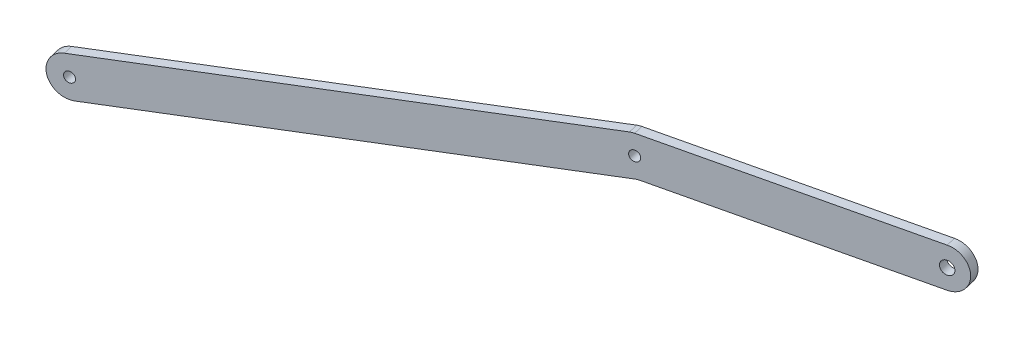
ISO-10303-21;
HEADER;
FILE_DESCRIPTION(('STEP AP214'),'2;1');
FILE_NAME('part.step','',(''),(''),'','','');
FILE_SCHEMA(('AUTOMOTIVE_DESIGN { 1 0 10303 214 1 1 1 1 }'));
ENDSEC;
DATA;
#1=APPLICATION_CONTEXT('core data for automotive mechanical design processes');
#2=APPLICATION_PROTOCOL_DEFINITION('international standard','automotive_design',2000,#1);
#3=PRODUCT_CONTEXT('',#1,'mechanical');
#4=PRODUCT('Part','Part','',(#3));
#5=PRODUCT_RELATED_PRODUCT_CATEGORY('part','',(#4));
#6=PRODUCT_DEFINITION_FORMATION('','',#4);
#7=PRODUCT_DEFINITION_CONTEXT('part definition',#1,'design');
#8=PRODUCT_DEFINITION('design','',#6,#7);
#9=PRODUCT_DEFINITION_SHAPE('','',#8);
#10=(LENGTH_UNIT() NAMED_UNIT(*) SI_UNIT(.MILLI.,.METRE.));
#11=(NAMED_UNIT(*) PLANE_ANGLE_UNIT() SI_UNIT($,.RADIAN.));
#12=(NAMED_UNIT(*) SI_UNIT($,.STERADIAN.) SOLID_ANGLE_UNIT());
#13=UNCERTAINTY_MEASURE_WITH_UNIT(LENGTH_MEASURE(1.E-05),#10,'distance_accuracy_value','');
#14=(GEOMETRIC_REPRESENTATION_CONTEXT(3) GLOBAL_UNCERTAINTY_ASSIGNED_CONTEXT((#13)) GLOBAL_UNIT_ASSIGNED_CONTEXT((#10,
#11,#12)) REPRESENTATION_CONTEXT('',''));
#15=CARTESIAN_POINT('',(0.,0.,0.));
#16=DIRECTION('',(0.,0.,1.));
#17=DIRECTION('',(1.,0.,0.));
#18=AXIS2_PLACEMENT_3D('',#15,#16,#17);
#19=CARTESIAN_POINT('',(-0.725230153584354,0.,-3.0910623132399));
#20=DIRECTION('',(0.22841894601082,0.,0.973562933303906));
#21=DIRECTION('',(0.973562933303906,0.,-0.22841894601082));
#22=AXIS2_PLACEMENT_3D('',#19,#20,#21);
#23=CYLINDRICAL_SURFACE('',#22,12.7);
#24=CARTESIAN_POINT('',(0.725230153584354,0.,3.0910623132399));
#25=DIRECTION('',(-0.22841894601082,0.,-0.973562933303906));
#26=DIRECTION('',(-0.973562933303906,0.,0.22841894601082));
#27=AXIS2_PLACEMENT_3D('',#24,#25,#26);
#28=CIRCLE('',#27,12.7);
#29=CARTESIAN_POINT('',(3.46788145490127,-12.3836097482895,2.44757692766136));
#30=VERTEX_POINT('',#29);
#31=CARTESIAN_POINT('',(-2.01742114773528,12.3836097482889,3.73454769881908));
#32=VERTEX_POINT('',#31);
#33=EDGE_CURVE('E159',#30,#32,#28,.T.);
#34=ORIENTED_EDGE('',*,*,#33,.T.);
#35=DIRECTION('',(0.22841894601082,0.,0.973562933303906));
#36=VECTOR('',#35,1.);
#37=CARTESIAN_POINT('',(-3.46788145490399,12.3836097482889,-2.44757692766073));
#38=LINE('',#37,#36);
#39=CARTESIAN_POINT('',(-3.46788145490399,12.3836097482889,-2.44757692766073));
#40=VERTEX_POINT('',#39);
#41=EDGE_CURVE('E11',#40,#32,#38,.T.);
#42=ORIENTED_EDGE('',*,*,#41,.F.);
#43=CARTESIAN_POINT('',(-0.725230153584354,0.,-3.0910623132399));
#44=DIRECTION('',(-0.22841894601082,0.,-0.973562933303906));
#45=DIRECTION('',(-0.973562933303906,0.,0.22841894601082));
#46=AXIS2_PLACEMENT_3D('',#43,#44,#45);
#47=CIRCLE('',#46,12.7);
#48=CARTESIAN_POINT('',(2.01742114773256,-12.3836097482895,-3.73454769881844));
#49=VERTEX_POINT('',#48);
#50=EDGE_CURVE('E233',#49,#40,#47,.T.);
#51=ORIENTED_EDGE('',*,*,#50,.F.);
#52=DIRECTION('',(0.22841894601082,0.,0.973562933303906));
#53=VECTOR('',#52,1.);
#54=CARTESIAN_POINT('',(2.01742114773256,-12.3836097482895,-3.73454769881844));
#55=LINE('',#54,#53);
#56=EDGE_CURVE('E154',#49,#30,#55,.T.);
#57=ORIENTED_EDGE('',*,*,#56,.T.);
#58=EDGE_LOOP('',(#34,#42,#51,#57));
#59=FACE_BOUND('',#58,.T.);
#60=ADVANCED_FACE('F45',(#59),#23,.T.);
#61=CARTESIAN_POINT('',(-3.46788145490265,12.3836097482892,-2.44757692766104));
#62=DIRECTION('',(0.215956795379393,-0.975087381755056,-0.0506681405967606));
#63=DIRECTION('',(0.976341448555132,0.216234538946179,0.));
#64=AXIS2_PLACEMENT_3D('',#61,#62,#63);
#65=PLANE('',#64);
#66=DIRECTION('',(0.949308931609078,0.221821094447914,-0.22272843200894));
#67=VECTOR('',#66,1.);
#68=CARTESIAN_POINT('',(-2.01742114773394,12.3836097482892,3.73454769881876));
#69=LINE('',#68,#67);
#70=CARTESIAN_POINT('',(294.94523679424,81.7736466493389,-65.9393223831915));
#71=VERTEX_POINT('',#70);
#72=EDGE_CURVE('E163',#32,#71,#69,.T.);
#73=ORIENTED_EDGE('',*,*,#72,.T.);
#74=DIRECTION('',(0.22841894601082,0.,0.973562933303906));
#75=VECTOR('',#74,1.);
#76=CARTESIAN_POINT('',(293.494776487071,81.7736466493389,-72.1214470096713));
#77=LINE('',#76,#75);
#78=CARTESIAN_POINT('',(293.494776487071,81.7736466493389,-72.1214470096713));
#79=VERTEX_POINT('',#78);
#80=EDGE_CURVE('E55',#79,#71,#77,.T.);
#81=ORIENTED_EDGE('',*,*,#80,.F.);
#82=DIRECTION('',(0.949308931609078,0.221821094447914,-0.22272843200894));
#83=VECTOR('',#82,1.);
#84=CARTESIAN_POINT('',(-3.46788145490265,12.3836097482892,-2.44757692766104));
#85=LINE('',#84,#83);
#86=EDGE_CURVE('E102',#40,#79,#85,.T.);
#87=ORIENTED_EDGE('',*,*,#86,.F.);
#88=ORIENTED_EDGE('',*,*,#41,.T.);
#89=EDGE_LOOP('',(#73,#81,#87,#88));
#90=FACE_BOUND('',#89,.T.);
#91=ADVANCED_FACE('F254',(#90),#65,.F.);
#92=CARTESIAN_POINT('',(296.237427788388,69.3900369010493,-72.7649323952498));
#93=DIRECTION('',(0.22841894601082,0.,0.973562933303906));
#94=DIRECTION('',(0.973562933303906,0.,-0.22841894601082));
#95=AXIS2_PLACEMENT_3D('',#92,#93,#94);
#96=CYLINDRICAL_SURFACE('',#95,12.7);
#97=CARTESIAN_POINT('',(297.687888095556,69.3900369010493,-66.58280776877));
#98=DIRECTION('',(-0.22841894601082,0.,-0.973562933303906));
#99=DIRECTION('',(-0.973562933303906,0.,0.22841894601082));
#100=AXIS2_PLACEMENT_3D('',#97,#98,#99);
#101=CIRCLE('',#100,12.7);
#102=CARTESIAN_POINT('',(297.687888095556,82.0900369010493,-66.58280776877));
#103=VERTEX_POINT('',#102);
#104=EDGE_CURVE('E166',#71,#103,#101,.T.);
#105=ORIENTED_EDGE('',*,*,#104,.T.);
#106=DIRECTION('',(0.22841894601082,0.,0.973562933303906));
#107=VECTOR('',#106,1.);
#108=CARTESIAN_POINT('',(296.237427788388,82.0900369010493,-72.7649323952498));
#109=LINE('',#108,#107);
#110=CARTESIAN_POINT('',(296.237427788388,82.0900369010493,-72.7649323952498));
#111=VERTEX_POINT('',#110);
#112=EDGE_CURVE('E201',#111,#103,#109,.T.);
#113=ORIENTED_EDGE('',*,*,#112,.F.);
#114=CARTESIAN_POINT('',(296.237427788388,69.3900369010493,-72.7649323952498));
#115=DIRECTION('',(-0.22841894601082,0.,-0.973562933303906));
#116=DIRECTION('',(-0.973562933303906,0.,0.22841894601082));
#117=AXIS2_PLACEMENT_3D('',#114,#115,#116);
#118=CIRCLE('',#117,12.7);
#119=EDGE_CURVE('E211',#79,#111,#118,.T.);
#120=ORIENTED_EDGE('',*,*,#119,.F.);
#121=ORIENTED_EDGE('',*,*,#80,.T.);
#122=EDGE_LOOP('',(#105,#113,#120,#121));
#123=FACE_BOUND('',#122,.T.);
#124=ADVANCED_FACE('F209',(#123),#96,.T.);
#125=CARTESIAN_POINT('',(-0.725230153584341,82.0900369010493,-3.09106231323976));
#126=DIRECTION('',(0.,-1.,0.));
#127=DIRECTION('',(0.,0.,-1.));
#128=AXIS2_PLACEMENT_3D('',#125,#126,#127);
#129=PLANE('',#128);
#130=DIRECTION('',(0.973562933303906,0.,-0.22841894601082));
#131=VECTOR('',#130,1.);
#132=CARTESIAN_POINT('',(0.725230153584366,82.0900369010493,3.09106231324005));
#133=LINE('',#132,#131);
#134=CARTESIAN_POINT('',(461.919917664668,82.0900369010494,-105.11519824104));
#135=VERTEX_POINT('',#134);
#136=EDGE_CURVE('E169',#103,#135,#133,.T.);
#137=ORIENTED_EDGE('',*,*,#136,.T.);
#138=DIRECTION('',(0.22841894601082,0.,0.973562933303906));
#139=VECTOR('',#138,1.);
#140=CARTESIAN_POINT('',(460.4694573575,82.0900369010495,-111.297322867519));
#141=LINE('',#140,#139);
#142=CARTESIAN_POINT('',(460.4694573575,82.0900369010495,-111.297322867519));
#143=VERTEX_POINT('',#142);
#144=EDGE_CURVE('E197',#143,#135,#141,.T.);
#145=ORIENTED_EDGE('',*,*,#144,.F.);
#146=DIRECTION('',(0.973562933303906,0.,-0.22841894601082));
#147=VECTOR('',#146,1.);
#148=CARTESIAN_POINT('',(-0.725230153584341,82.0900369010493,-3.09106231323976));
#149=LINE('',#148,#147);
#150=EDGE_CURVE('E225',#111,#143,#149,.T.);
#151=ORIENTED_EDGE('',*,*,#150,.F.);
#152=ORIENTED_EDGE('',*,*,#112,.T.);
#153=EDGE_LOOP('',(#137,#145,#151,#152));
#154=FACE_BOUND('',#153,.T.);
#155=ADVANCED_FACE('F220',(#154),#129,.F.);
#156=CARTESIAN_POINT('',(460.4694573575,69.3900369010495,-111.297322867519));
#157=DIRECTION('',(0.22841894601082,0.,0.973562933303906));
#158=DIRECTION('',(0.973562933303906,0.,-0.22841894601082));
#159=AXIS2_PLACEMENT_3D('',#156,#157,#158);
#160=CYLINDRICAL_SURFACE('',#159,12.7);
#161=CARTESIAN_POINT('',(461.919917664668,69.3900369010494,-105.11519824104));
#162=DIRECTION('',(-0.22841894601082,0.,-0.973562933303906));
#163=DIRECTION('',(-0.973562933303906,0.,0.22841894601082));
#164=AXIS2_PLACEMENT_3D('',#161,#162,#163);
#165=CIRCLE('',#164,12.7);
#166=CARTESIAN_POINT('',(461.919917664668,56.6900369010494,-105.11519824104));
#167=VERTEX_POINT('',#166);
#168=EDGE_CURVE('E172',#135,#167,#165,.T.);
#169=ORIENTED_EDGE('',*,*,#168,.T.);
#170=DIRECTION('',(0.22841894601082,0.,0.973562933303906));
#171=VECTOR('',#170,1.);
#172=CARTESIAN_POINT('',(460.4694573575,56.6900369010494,-111.29732286752));
#173=LINE('',#172,#171);
#174=CARTESIAN_POINT('',(460.4694573575,56.6900369010494,-111.29732286752));
#175=VERTEX_POINT('',#174);
#176=EDGE_CURVE('E137',#175,#167,#173,.T.);
#177=ORIENTED_EDGE('',*,*,#176,.F.);
#178=CARTESIAN_POINT('',(460.4694573575,69.3900369010495,-111.297322867519));
#179=DIRECTION('',(-0.22841894601082,0.,-0.973562933303906));
#180=DIRECTION('',(-0.973562933303906,0.,0.22841894601082));
#181=AXIS2_PLACEMENT_3D('',#178,#179,#180);
#182=CIRCLE('',#181,12.7);
#183=EDGE_CURVE('E122',#143,#175,#182,.T.);
#184=ORIENTED_EDGE('',*,*,#183,.F.);
#185=ORIENTED_EDGE('',*,*,#144,.T.);
#186=EDGE_LOOP('',(#169,#177,#184,#185));
#187=FACE_BOUND('',#186,.T.);
#188=ADVANCED_FACE('F223',(#187),#160,.T.);
#189=CARTESIAN_POINT('',(-0.725230153584338,56.6900369010494,-3.0910623132398));
#190=DIRECTION('',(0.,1.,0.));
#191=DIRECTION('',(0.,0.,1.));
#192=AXIS2_PLACEMENT_3D('',#189,#190,#191);
#193=PLANE('',#192);
#194=DIRECTION('',(-0.973562933303906,0.,0.22841894601082));
#195=VECTOR('',#194,1.);
#196=CARTESIAN_POINT('',(0.725230153584369,56.6900369010494,3.09106231324));
#197=LINE('',#196,#195);
#198=CARTESIAN_POINT('',(300.465133625708,56.6900369010494,-67.2344097095481));
#199=VERTEX_POINT('',#198);
#200=EDGE_CURVE('E132',#167,#199,#197,.T.);
#201=ORIENTED_EDGE('',*,*,#200,.T.);
#202=DIRECTION('',(0.22841894601082,0.,0.973562933303906));
#203=VECTOR('',#202,1.);
#204=CARTESIAN_POINT('',(299.014673318539,56.6900369010494,-73.4165343360279));
#205=LINE('',#204,#203);
#206=CARTESIAN_POINT('',(299.014673318539,56.6900369010494,-73.4165343360279));
#207=VERTEX_POINT('',#206);
#208=EDGE_CURVE('E129',#207,#199,#205,.T.);
#209=ORIENTED_EDGE('',*,*,#208,.F.);
#210=DIRECTION('',(-0.973562933303906,0.,0.22841894601082));
#211=VECTOR('',#210,1.);
#212=CARTESIAN_POINT('',(-0.725230153584338,56.6900369010494,-3.0910623132398));
#213=LINE('',#212,#211);
#214=EDGE_CURVE('E115',#175,#207,#213,.T.);
#215=ORIENTED_EDGE('',*,*,#214,.F.);
#216=ORIENTED_EDGE('',*,*,#176,.T.);
#217=EDGE_LOOP('',(#201,#209,#215,#216));
#218=FACE_BOUND('',#217,.T.);
#219=ADVANCED_FACE('F130',(#218),#193,.F.);
#220=CARTESIAN_POINT('',(299.014673318539,43.9900369010494,-73.4165343360279));
#221=DIRECTION('',(0.22841894601082,0.,0.973562933303906));
#222=DIRECTION('',(0.973562933303906,0.,-0.22841894601082));
#223=AXIS2_PLACEMENT_3D('',#220,#221,#222);
#224=CYLINDRICAL_SURFACE('',#223,12.7);
#225=CARTESIAN_POINT('',(300.465133625708,43.9900369010494,-67.2344097095481));
#226=DIRECTION('',(-0.22841894601082,0.,-0.973562933303906));
#227=DIRECTION('',(-0.973562933303906,0.,0.22841894601082));
#228=AXIS2_PLACEMENT_3D('',#225,#226,#227);
#229=CIRCLE('',#228,12.7);
#230=CARTESIAN_POINT('',(297.722482324391,56.373646649339,-66.5909243239697));
#231=VERTEX_POINT('',#230);
#232=EDGE_CURVE('E177',#231,#199,#229,.T.);
#233=ORIENTED_EDGE('',*,*,#232,.F.);
#234=DIRECTION('',(0.22841894601082,0.,0.973562933303906));
#235=VECTOR('',#234,1.);
#236=CARTESIAN_POINT('',(296.272022017222,56.373646649339,-72.7730489504495));
#237=LINE('',#236,#235);
#238=CARTESIAN_POINT('',(296.272022017222,56.373646649339,-72.7730489504495));
#239=VERTEX_POINT('',#238);
#240=EDGE_CURVE('E91',#239,#231,#237,.T.);
#241=ORIENTED_EDGE('',*,*,#240,.F.);
#242=CARTESIAN_POINT('',(299.014673318539,43.9900369010494,-73.4165343360279));
#243=DIRECTION('',(-0.22841894601082,0.,-0.973562933303906));
#244=DIRECTION('',(-0.973562933303906,0.,0.22841894601082));
#245=AXIS2_PLACEMENT_3D('',#242,#243,#244);
#246=CIRCLE('',#245,12.7);
#247=EDGE_CURVE('E120',#239,#207,#246,.T.);
#248=ORIENTED_EDGE('',*,*,#247,.T.);
#249=ORIENTED_EDGE('',*,*,#208,.T.);
#250=EDGE_LOOP('',(#233,#241,#248,#249));
#251=FACE_BOUND('',#250,.T.);
#252=ADVANCED_FACE('F139',(#251),#224,.F.);
#253=CARTESIAN_POINT('',(460.4694573575,69.3900369010495,-111.29732286752));
#254=DIRECTION('',(0.22841894601082,0.,0.973562933303906));
#255=DIRECTION('',(0.973562933303906,0.,-0.22841894601082));
#256=AXIS2_PLACEMENT_3D('',#253,#254,#255);
#257=CYLINDRICAL_SURFACE('',#256,4.19988999999994);
#258=CARTESIAN_POINT('',(460.4694573575,69.3900369010495,-111.29732286752));
#259=DIRECTION('',(-0.22841894601082,0.,-0.973562933303906));
#260=DIRECTION('',(-0.973562933303906,0.,0.22841894601082));
#261=AXIS2_PLACEMENT_3D('',#258,#259,#260);
#262=CIRCLE('',#261,4.19988999999994);
#263=CARTESIAN_POINT('',(456.380600129546,69.3900369010495,-110.337988420358));
#264=VERTEX_POINT('',#263);
#265=EDGE_CURVE('E143',#264,#264,#262,.T.);
#266=ORIENTED_EDGE('',*,*,#265,.T.);
#267=EDGE_LOOP('',(#266));
#268=FACE_BOUND('',#267,.T.);
#269=CARTESIAN_POINT('',(461.919917664668,69.3900369010494,-105.11519824104));
#270=DIRECTION('',(-0.22841894601082,0.,-0.973562933303906));
#271=DIRECTION('',(-0.973562933303906,0.,0.22841894601082));
#272=AXIS2_PLACEMENT_3D('',#269,#270,#271);
#273=CIRCLE('',#272,4.19988999999994);
#274=CARTESIAN_POINT('',(457.831060436715,69.3900369010494,-104.155863793878));
#275=VERTEX_POINT('',#274);
#276=EDGE_CURVE('E182',#275,#275,#273,.T.);
#277=ORIENTED_EDGE('',*,*,#276,.F.);
#278=EDGE_LOOP('',(#277));
#279=FACE_BOUND('',#278,.T.);
#280=ADVANCED_FACE('F271',(#268,#279),#257,.F.);
#281=CARTESIAN_POINT('',(2.01742114773394,-12.3836097482892,-3.73454769881876));
#282=DIRECTION('',(-0.215956795379393,0.975087381755056,0.0506681405967606));
#283=DIRECTION('',(-0.976341448555132,-0.216234538946178,0.));
#284=AXIS2_PLACEMENT_3D('',#281,#282,#283);
#285=PLANE('',#284);
#286=DIRECTION('',(-0.949308931609078,-0.221821094447913,0.22272843200894));
#287=VECTOR('',#286,1.);
#288=CARTESIAN_POINT('',(3.46788145490264,-12.3836097482892,2.44757692766104));
#289=LINE('',#288,#287);
#290=EDGE_CURVE('E94',#231,#30,#289,.T.);
#291=ORIENTED_EDGE('',*,*,#290,.T.);
#292=ORIENTED_EDGE('',*,*,#56,.F.);
#293=DIRECTION('',(-0.949308931609078,-0.221821094447913,0.22272843200894));
#294=VECTOR('',#293,1.);
#295=CARTESIAN_POINT('',(2.01742114773394,-12.3836097482892,-3.73454769881876));
#296=LINE('',#295,#294);
#297=EDGE_CURVE('E63',#239,#49,#296,.T.);
#298=ORIENTED_EDGE('',*,*,#297,.F.);
#299=ORIENTED_EDGE('',*,*,#240,.T.);
#300=EDGE_LOOP('',(#291,#292,#298,#299));
#301=FACE_BOUND('',#300,.T.);
#302=ADVANCED_FACE('F272',(#301),#285,.F.);
#303=CARTESIAN_POINT('',(-0.725230153584354,0.,-3.0910623132399));
#304=DIRECTION('',(0.22841894601082,0.,0.973562933303906));
#305=DIRECTION('',(0.973562933303906,0.,-0.22841894601082));
#306=AXIS2_PLACEMENT_3D('',#303,#304,#305);
#307=CYLINDRICAL_SURFACE('',#306,3.2639);
#308=CARTESIAN_POINT('',(-0.725230153584354,0.,-3.0910623132399));
#309=DIRECTION('',(-0.22841894601082,0.,-0.973562933303906));
#310=DIRECTION('',(-0.973562933303906,0.,0.22841894601082));
#311=AXIS2_PLACEMENT_3D('',#308,#309,#310);
#312=CIRCLE('',#311,3.2639);
#313=CARTESIAN_POINT('',(-3.90284221159497,0.,-2.34552571535519));
#314=VERTEX_POINT('',#313);
#315=EDGE_CURVE('E190',#314,#314,#312,.T.);
#316=ORIENTED_EDGE('',*,*,#315,.T.);
#317=EDGE_LOOP('',(#316));
#318=FACE_BOUND('',#317,.T.);
#319=CARTESIAN_POINT('',(0.725230153584354,0.,3.0910623132399));
#320=DIRECTION('',(-0.22841894601082,0.,-0.973562933303906));
#321=DIRECTION('',(-0.973562933303906,0.,0.22841894601082));
#322=AXIS2_PLACEMENT_3D('',#319,#320,#321);
#323=CIRCLE('',#322,3.2639);
#324=CARTESIAN_POINT('',(-2.45238190442627,0.,3.83659891112462));
#325=VERTEX_POINT('',#324);
#326=EDGE_CURVE('E155',#325,#325,#323,.T.);
#327=ORIENTED_EDGE('',*,*,#326,.F.);
#328=EDGE_LOOP('',(#327));
#329=FACE_BOUND('',#328,.T.);
#330=ADVANCED_FACE('F47',(#318,#329),#307,.F.);
#331=CARTESIAN_POINT('',(296.237427788388,69.3900369010493,-72.7649323952498));
#332=DIRECTION('',(0.22841894601082,0.,0.973562933303906));
#333=DIRECTION('',(0.973562933303906,0.,-0.22841894601082));
#334=AXIS2_PLACEMENT_3D('',#331,#332,#333);
#335=CYLINDRICAL_SURFACE('',#334,3.2639);
#336=CARTESIAN_POINT('',(296.237427788388,69.3900369010493,-72.7649323952498));
#337=DIRECTION('',(-0.22841894601082,0.,-0.973562933303906));
#338=DIRECTION('',(-0.973562933303906,0.,0.22841894601082));
#339=AXIS2_PLACEMENT_3D('',#336,#337,#338);
#340=CIRCLE('',#339,3.2639);
#341=CARTESIAN_POINT('',(293.059815730377,69.3900369010493,-72.0193957973651));
#342=VERTEX_POINT('',#341);
#343=EDGE_CURVE('E150',#342,#342,#340,.T.);
#344=ORIENTED_EDGE('',*,*,#343,.T.);
#345=EDGE_LOOP('',(#344));
#346=FACE_BOUND('',#345,.T.);
#347=CARTESIAN_POINT('',(297.687888095556,69.3900369010493,-66.58280776877));
#348=DIRECTION('',(-0.22841894601082,0.,-0.973562933303906));
#349=DIRECTION('',(-0.973562933303906,0.,0.22841894601082));
#350=AXIS2_PLACEMENT_3D('',#347,#348,#349);
#351=CIRCLE('',#350,3.2639);
#352=CARTESIAN_POINT('',(294.510276037546,69.3900369010493,-65.8372711708853));
#353=VERTEX_POINT('',#352);
#354=EDGE_CURVE('E186',#353,#353,#351,.T.);
#355=ORIENTED_EDGE('',*,*,#354,.F.);
#356=EDGE_LOOP('',(#355));
#357=FACE_BOUND('',#356,.T.);
#358=ADVANCED_FACE('F243',(#346,#357),#335,.F.);
#359=CARTESIAN_POINT('',(-0.725230153584354,0.,-3.0910623132399));
#360=DIRECTION('',(-0.22841894601082,0.,-0.973562933303906));
#361=DIRECTION('',(-0.973562933303906,0.,0.22841894601082));
#362=AXIS2_PLACEMENT_3D('',#359,#360,#361);
#363=PLANE('',#362);
#364=ORIENTED_EDGE('',*,*,#315,.F.);
#365=EDGE_LOOP('',(#364));
#366=FACE_BOUND('',#365,.T.);
#367=ORIENTED_EDGE('',*,*,#50,.T.);
#368=ORIENTED_EDGE('',*,*,#86,.T.);
#369=ORIENTED_EDGE('',*,*,#119,.T.);
#370=ORIENTED_EDGE('',*,*,#150,.T.);
#371=ORIENTED_EDGE('',*,*,#183,.T.);
#372=ORIENTED_EDGE('',*,*,#214,.T.);
#373=ORIENTED_EDGE('',*,*,#247,.F.);
#374=ORIENTED_EDGE('',*,*,#297,.T.);
#375=EDGE_LOOP('',(#367,#368,#369,#370,#371,#372,#373,#374));
#376=FACE_BOUND('',#375,.T.);
#377=ORIENTED_EDGE('',*,*,#265,.F.);
#378=EDGE_LOOP('',(#377));
#379=FACE_BOUND('',#378,.T.);
#380=ORIENTED_EDGE('',*,*,#343,.F.);
#381=EDGE_LOOP('',(#380));
#382=FACE_BOUND('',#381,.T.);
#383=ADVANCED_FACE('F117',(#366,#376,#379,#382),#363,.T.);
#384=CARTESIAN_POINT('',(0.725230153584354,0.,3.0910623132399));
#385=DIRECTION('',(-0.22841894601082,0.,-0.973562933303906));
#386=DIRECTION('',(-0.973562933303906,0.,0.22841894601082));
#387=AXIS2_PLACEMENT_3D('',#384,#385,#386);
#388=PLANE('',#387);
#389=ORIENTED_EDGE('',*,*,#326,.T.);
#390=EDGE_LOOP('',(#389));
#391=FACE_BOUND('',#390,.T.);
#392=ORIENTED_EDGE('',*,*,#33,.F.);
#393=ORIENTED_EDGE('',*,*,#290,.F.);
#394=ORIENTED_EDGE('',*,*,#232,.T.);
#395=ORIENTED_EDGE('',*,*,#200,.F.);
#396=ORIENTED_EDGE('',*,*,#168,.F.);
#397=ORIENTED_EDGE('',*,*,#136,.F.);
#398=ORIENTED_EDGE('',*,*,#104,.F.);
#399=ORIENTED_EDGE('',*,*,#72,.F.);
#400=EDGE_LOOP('',(#392,#393,#394,#395,#396,#397,#398,#399));
#401=FACE_BOUND('',#400,.T.);
#402=ORIENTED_EDGE('',*,*,#276,.T.);
#403=EDGE_LOOP('',(#402));
#404=FACE_BOUND('',#403,.T.);
#405=ORIENTED_EDGE('',*,*,#354,.T.);
#406=EDGE_LOOP('',(#405));
#407=FACE_BOUND('',#406,.T.);
#408=ADVANCED_FACE('F215',(#391,#401,#404,#407),#388,.F.);
#409=CLOSED_SHELL('',(#60,#91,#124,#155,#188,#219,#252,#280,#302,#330,#358,#383,#408));
#410=MANIFOLD_SOLID_BREP('B2',#409);
#411=ADVANCED_BREP_SHAPE_REPRESENTATION('',(#18,#410),#14);
#412=SHAPE_DEFINITION_REPRESENTATION(#9,#411);
ENDSEC;
END-ISO-10303-21;
